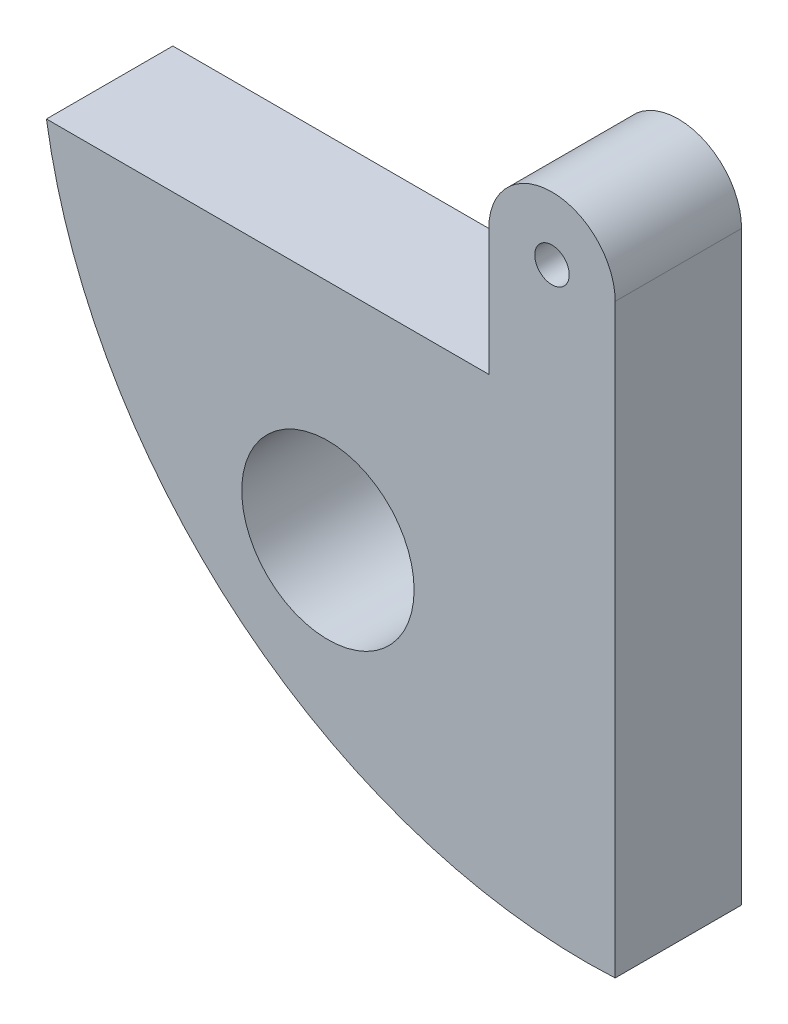
ISO-10303-21;
HEADER;
FILE_DESCRIPTION(('STEP AP214'),'2;1');
FILE_NAME('part.step','',(''),(''),'','','');
FILE_SCHEMA(('AUTOMOTIVE_DESIGN { 1 0 10303 214 1 1 1 1 }'));
ENDSEC;
DATA;
#1=APPLICATION_CONTEXT('core data for automotive mechanical design processes');
#2=APPLICATION_PROTOCOL_DEFINITION('international standard','automotive_design',2000,#1);
#3=PRODUCT_CONTEXT('',#1,'mechanical');
#4=PRODUCT('Part','Part','',(#3));
#5=PRODUCT_RELATED_PRODUCT_CATEGORY('part','',(#4));
#6=PRODUCT_DEFINITION_FORMATION('','',#4);
#7=PRODUCT_DEFINITION_CONTEXT('part definition',#1,'design');
#8=PRODUCT_DEFINITION('design','',#6,#7);
#9=PRODUCT_DEFINITION_SHAPE('','',#8);
#10=(LENGTH_UNIT() NAMED_UNIT(*) SI_UNIT(.MILLI.,.METRE.));
#11=(NAMED_UNIT(*) PLANE_ANGLE_UNIT() SI_UNIT($,.RADIAN.));
#12=(NAMED_UNIT(*) SI_UNIT($,.STERADIAN.) SOLID_ANGLE_UNIT());
#13=UNCERTAINTY_MEASURE_WITH_UNIT(LENGTH_MEASURE(1.E-05),#10,'distance_accuracy_value','');
#14=(GEOMETRIC_REPRESENTATION_CONTEXT(3) GLOBAL_UNCERTAINTY_ASSIGNED_CONTEXT((#13)) GLOBAL_UNIT_ASSIGNED_CONTEXT((#10,
#11,#12)) REPRESENTATION_CONTEXT('',''));
#15=CARTESIAN_POINT('',(0.,0.,0.));
#16=DIRECTION('',(0.,0.,1.));
#17=DIRECTION('',(1.,0.,0.));
#18=AXIS2_PLACEMENT_3D('',#15,#16,#17);
#19=CARTESIAN_POINT('',(-5.16928802794679,53.8592560654158,22.));
#20=DIRECTION('',(0.,0.,-1.));
#21=DIRECTION('',(-1.,0.,0.));
#22=AXIS2_PLACEMENT_3D('',#19,#20,#21);
#23=PLANE('',#22);
#24=DIRECTION('',(0.,1.,0.));
#25=VECTOR('',#24,1.);
#26=CARTESIAN_POINT('',(0.,0.,22.));
#27=LINE('',#26,#25);
#28=CARTESIAN_POINT('',(0.,-41.,22.));
#29=VERTEX_POINT('',#28);
#30=CARTESIAN_POINT('',(0.,61.,22.));
#31=VERTEX_POINT('',#30);
#32=EDGE_CURVE('E82',#29,#31,#27,.T.);
#33=ORIENTED_EDGE('',*,*,#32,.T.);
#34=CARTESIAN_POINT('',(-11.,61.,22.));
#35=DIRECTION('',(0.,0.,1.));
#36=DIRECTION('',(-1.,0.,0.));
#37=AXIS2_PLACEMENT_3D('',#34,#35,#36);
#38=CIRCLE('',#37,11.);
#39=CARTESIAN_POINT('',(-22.,61.,22.));
#40=VERTEX_POINT('',#39);
#41=EDGE_CURVE('E93',#31,#40,#38,.T.);
#42=ORIENTED_EDGE('',*,*,#41,.T.);
#43=DIRECTION('',(0.,-1.,0.));
#44=VECTOR('',#43,1.);
#45=CARTESIAN_POINT('',(-22.,39.,22.));
#46=LINE('',#45,#44);
#47=CARTESIAN_POINT('',(-22.,39.,22.));
#48=VERTEX_POINT('',#47);
#49=EDGE_CURVE('E87',#40,#48,#46,.T.);
#50=ORIENTED_EDGE('',*,*,#49,.T.);
#51=DIRECTION('',(-1.,0.,0.));
#52=VECTOR('',#51,1.);
#53=CARTESIAN_POINT('',(-22.,39.,22.));
#54=LINE('',#53,#52);
#55=CARTESIAN_POINT('',(-99.,39.,22.));
#56=VERTEX_POINT('',#55);
#57=EDGE_CURVE('E91',#48,#56,#54,.T.);
#58=ORIENTED_EDGE('',*,*,#57,.T.);
#59=CARTESIAN_POINT('',(-5.16928802794679,53.8592560654158,22.));
#60=DIRECTION('',(0.,0.,1.));
#61=DIRECTION('',(-1.,0.,0.));
#62=AXIS2_PLACEMENT_3D('',#59,#60,#61);
#63=CIRCLE('',#62,95.);
#64=EDGE_CURVE('E49',#56,#29,#63,.T.);
#65=ORIENTED_EDGE('',*,*,#64,.T.);
#66=EDGE_LOOP('',(#33,#42,#50,#58,#65));
#67=FACE_BOUND('',#66,.T.);
#68=CARTESIAN_POINT('',(-50.,0.,22.));
#69=DIRECTION('',(0.,0.,1.));
#70=DIRECTION('',(1.,0.,0.));
#71=AXIS2_PLACEMENT_3D('',#68,#69,#70);
#72=CIRCLE('',#71,15.);
#73=CARTESIAN_POINT('',(-35.,0.,22.));
#74=VERTEX_POINT('',#73);
#75=EDGE_CURVE('E112',#74,#74,#72,.T.);
#76=ORIENTED_EDGE('',*,*,#75,.F.);
#77=EDGE_LOOP('',(#76));
#78=FACE_BOUND('',#77,.T.);
#79=CARTESIAN_POINT('',(-11.,61.,22.));
#80=DIRECTION('',(0.,0.,1.));
#81=DIRECTION('',(1.,0.,0.));
#82=AXIS2_PLACEMENT_3D('',#79,#80,#81);
#83=CIRCLE('',#82,3.);
#84=CARTESIAN_POINT('',(-8.,61.,22.));
#85=VERTEX_POINT('',#84);
#86=EDGE_CURVE('E131',#85,#85,#83,.T.);
#87=ORIENTED_EDGE('',*,*,#86,.F.);
#88=EDGE_LOOP('',(#87));
#89=FACE_BOUND('',#88,.T.);
#90=ADVANCED_FACE('F32',(#67,#78,#89),#23,.F.);
#91=CARTESIAN_POINT('',(-5.16928802794679,53.8592560654158,0.));
#92=DIRECTION('',(0.,0.,-1.));
#93=DIRECTION('',(-1.,0.,0.));
#94=AXIS2_PLACEMENT_3D('',#91,#92,#93);
#95=PLANE('',#94);
#96=CARTESIAN_POINT('',(-50.,0.,0.));
#97=DIRECTION('',(0.,0.,1.));
#98=DIRECTION('',(1.,0.,0.));
#99=AXIS2_PLACEMENT_3D('',#96,#97,#98);
#100=CIRCLE('',#99,15.);
#101=CARTESIAN_POINT('',(-35.,0.,0.));
#102=VERTEX_POINT('',#101);
#103=EDGE_CURVE('E128',#102,#102,#100,.T.);
#104=ORIENTED_EDGE('',*,*,#103,.T.);
#105=EDGE_LOOP('',(#104));
#106=FACE_BOUND('',#105,.T.);
#107=DIRECTION('',(0.,1.,0.));
#108=VECTOR('',#107,1.);
#109=CARTESIAN_POINT('',(0.,0.,0.));
#110=LINE('',#109,#108);
#111=CARTESIAN_POINT('',(0.,-41.,0.));
#112=VERTEX_POINT('',#111);
#113=CARTESIAN_POINT('',(0.,61.,0.));
#114=VERTEX_POINT('',#113);
#115=EDGE_CURVE('E76',#112,#114,#110,.T.);
#116=ORIENTED_EDGE('',*,*,#115,.F.);
#117=CARTESIAN_POINT('',(-5.16928802794679,53.8592560654158,0.));
#118=DIRECTION('',(0.,0.,1.));
#119=DIRECTION('',(-1.,0.,0.));
#120=AXIS2_PLACEMENT_3D('',#117,#118,#119);
#121=CIRCLE('',#120,95.);
#122=CARTESIAN_POINT('',(-99.,39.,0.));
#123=VERTEX_POINT('',#122);
#124=EDGE_CURVE('E116',#123,#112,#121,.T.);
#125=ORIENTED_EDGE('',*,*,#124,.F.);
#126=DIRECTION('',(-1.,0.,0.));
#127=VECTOR('',#126,1.);
#128=CARTESIAN_POINT('',(-22.,39.,0.));
#129=LINE('',#128,#127);
#130=CARTESIAN_POINT('',(-22.,39.,0.));
#131=VERTEX_POINT('',#130);
#132=EDGE_CURVE('E69',#131,#123,#129,.T.);
#133=ORIENTED_EDGE('',*,*,#132,.F.);
#134=DIRECTION('',(0.,-1.,0.));
#135=VECTOR('',#134,1.);
#136=CARTESIAN_POINT('',(-22.,39.,0.));
#137=LINE('',#136,#135);
#138=CARTESIAN_POINT('',(-22.,61.,0.));
#139=VERTEX_POINT('',#138);
#140=EDGE_CURVE('E101',#139,#131,#137,.T.);
#141=ORIENTED_EDGE('',*,*,#140,.F.);
#142=CARTESIAN_POINT('',(-11.,61.,0.));
#143=DIRECTION('',(0.,0.,1.));
#144=DIRECTION('',(-1.,0.,0.));
#145=AXIS2_PLACEMENT_3D('',#142,#143,#144);
#146=CIRCLE('',#145,11.);
#147=EDGE_CURVE('E111',#114,#139,#146,.T.);
#148=ORIENTED_EDGE('',*,*,#147,.F.);
#149=EDGE_LOOP('',(#116,#125,#133,#141,#148));
#150=FACE_BOUND('',#149,.T.);
#151=CARTESIAN_POINT('',(-11.,61.,0.));
#152=DIRECTION('',(0.,0.,1.));
#153=DIRECTION('',(1.,0.,0.));
#154=AXIS2_PLACEMENT_3D('',#151,#152,#153);
#155=CIRCLE('',#154,3.);
#156=CARTESIAN_POINT('',(-8.,61.,0.));
#157=VERTEX_POINT('',#156);
#158=EDGE_CURVE('E134',#157,#157,#155,.T.);
#159=ORIENTED_EDGE('',*,*,#158,.T.);
#160=EDGE_LOOP('',(#159));
#161=FACE_BOUND('',#160,.T.);
#162=ADVANCED_FACE('F121',(#106,#150,#161),#95,.T.);
#163=CARTESIAN_POINT('',(0.,0.,22.));
#164=DIRECTION('',(-1.,0.,0.));
#165=DIRECTION('',(0.,0.,1.));
#166=AXIS2_PLACEMENT_3D('',#163,#164,#165);
#167=PLANE('',#166);
#168=ORIENTED_EDGE('',*,*,#115,.T.);
#169=DIRECTION('',(0.,0.,-1.));
#170=VECTOR('',#169,1.);
#171=CARTESIAN_POINT('',(0.,61.,22.));
#172=LINE('',#171,#170);
#173=EDGE_CURVE('E11',#31,#114,#172,.T.);
#174=ORIENTED_EDGE('',*,*,#173,.F.);
#175=ORIENTED_EDGE('',*,*,#32,.F.);
#176=DIRECTION('',(0.,0.,-1.));
#177=VECTOR('',#176,1.);
#178=CARTESIAN_POINT('',(0.,-41.,22.));
#179=LINE('',#178,#177);
#180=EDGE_CURVE('E106',#29,#112,#179,.T.);
#181=ORIENTED_EDGE('',*,*,#180,.T.);
#182=EDGE_LOOP('',(#168,#174,#175,#181));
#183=FACE_BOUND('',#182,.T.);
#184=ADVANCED_FACE('F34',(#183),#167,.F.);
#185=CARTESIAN_POINT('',(-11.,61.,22.));
#186=DIRECTION('',(0.,0.,-1.));
#187=DIRECTION('',(-1.,0.,0.));
#188=AXIS2_PLACEMENT_3D('',#185,#186,#187);
#189=CYLINDRICAL_SURFACE('',#188,11.);
#190=ORIENTED_EDGE('',*,*,#147,.T.);
#191=DIRECTION('',(0.,0.,-1.));
#192=VECTOR('',#191,1.);
#193=CARTESIAN_POINT('',(-22.,61.,22.));
#194=LINE('',#193,#192);
#195=EDGE_CURVE('E41',#40,#139,#194,.T.);
#196=ORIENTED_EDGE('',*,*,#195,.F.);
#197=ORIENTED_EDGE('',*,*,#41,.F.);
#198=ORIENTED_EDGE('',*,*,#173,.T.);
#199=EDGE_LOOP('',(#190,#196,#197,#198));
#200=FACE_BOUND('',#199,.T.);
#201=ADVANCED_FACE('F159',(#200),#189,.T.);
#202=CARTESIAN_POINT('',(-22.,39.,22.));
#203=DIRECTION('',(1.,0.,0.));
#204=DIRECTION('',(0.,1.,0.));
#205=AXIS2_PLACEMENT_3D('',#202,#203,#204);
#206=PLANE('',#205);
#207=ORIENTED_EDGE('',*,*,#140,.T.);
#208=DIRECTION('',(0.,0.,-1.));
#209=VECTOR('',#208,1.);
#210=CARTESIAN_POINT('',(-22.,39.,22.));
#211=LINE('',#210,#209);
#212=EDGE_CURVE('E98',#48,#131,#211,.T.);
#213=ORIENTED_EDGE('',*,*,#212,.F.);
#214=ORIENTED_EDGE('',*,*,#49,.F.);
#215=ORIENTED_EDGE('',*,*,#195,.T.);
#216=EDGE_LOOP('',(#207,#213,#214,#215));
#217=FACE_BOUND('',#216,.T.);
#218=ADVANCED_FACE('F99',(#217),#206,.F.);
#219=CARTESIAN_POINT('',(-22.,39.,22.));
#220=DIRECTION('',(0.,-1.,0.));
#221=DIRECTION('',(0.,0.,-1.));
#222=AXIS2_PLACEMENT_3D('',#219,#220,#221);
#223=PLANE('',#222);
#224=ORIENTED_EDGE('',*,*,#132,.T.);
#225=DIRECTION('',(0.,0.,-1.));
#226=VECTOR('',#225,1.);
#227=CARTESIAN_POINT('',(-99.,39.,22.));
#228=LINE('',#227,#226);
#229=EDGE_CURVE('E102',#56,#123,#228,.T.);
#230=ORIENTED_EDGE('',*,*,#229,.F.);
#231=ORIENTED_EDGE('',*,*,#57,.F.);
#232=ORIENTED_EDGE('',*,*,#212,.T.);
#233=EDGE_LOOP('',(#224,#230,#231,#232));
#234=FACE_BOUND('',#233,.T.);
#235=ADVANCED_FACE('F104',(#234),#223,.F.);
#236=CARTESIAN_POINT('',(-5.16928802794679,53.8592560654158,22.));
#237=DIRECTION('',(0.,0.,-1.));
#238=DIRECTION('',(-1.,0.,0.));
#239=AXIS2_PLACEMENT_3D('',#236,#237,#238);
#240=CYLINDRICAL_SURFACE('',#239,95.);
#241=ORIENTED_EDGE('',*,*,#124,.T.);
#242=ORIENTED_EDGE('',*,*,#180,.F.);
#243=ORIENTED_EDGE('',*,*,#64,.F.);
#244=ORIENTED_EDGE('',*,*,#229,.T.);
#245=EDGE_LOOP('',(#241,#242,#243,#244));
#246=FACE_BOUND('',#245,.T.);
#247=ADVANCED_FACE('F124',(#246),#240,.T.);
#248=CARTESIAN_POINT('',(-50.,0.,22.));
#249=DIRECTION('',(0.,0.,-1.));
#250=DIRECTION('',(-1.,0.,0.));
#251=AXIS2_PLACEMENT_3D('',#248,#249,#250);
#252=CYLINDRICAL_SURFACE('',#251,15.);
#253=ORIENTED_EDGE('',*,*,#75,.T.);
#254=EDGE_LOOP('',(#253));
#255=FACE_BOUND('',#254,.T.);
#256=ORIENTED_EDGE('',*,*,#103,.F.);
#257=EDGE_LOOP('',(#256));
#258=FACE_BOUND('',#257,.T.);
#259=ADVANCED_FACE('F151',(#255,#258),#252,.F.);
#260=CARTESIAN_POINT('',(-11.,61.,22.));
#261=DIRECTION('',(0.,0.,-1.));
#262=DIRECTION('',(-1.,0.,0.));
#263=AXIS2_PLACEMENT_3D('',#260,#261,#262);
#264=CYLINDRICAL_SURFACE('',#263,3.);
#265=ORIENTED_EDGE('',*,*,#86,.T.);
#266=EDGE_LOOP('',(#265));
#267=FACE_BOUND('',#266,.T.);
#268=ORIENTED_EDGE('',*,*,#158,.F.);
#269=EDGE_LOOP('',(#268));
#270=FACE_BOUND('',#269,.T.);
#271=ADVANCED_FACE('F140',(#267,#270),#264,.F.);
#272=CLOSED_SHELL('',(#90,#162,#184,#201,#218,#235,#247,#259,#271));
#273=MANIFOLD_SOLID_BREP('B2',#272);
#274=ADVANCED_BREP_SHAPE_REPRESENTATION('',(#18,#273),#14);
#275=SHAPE_DEFINITION_REPRESENTATION(#9,#274);
ENDSEC;
END-ISO-10303-21;
